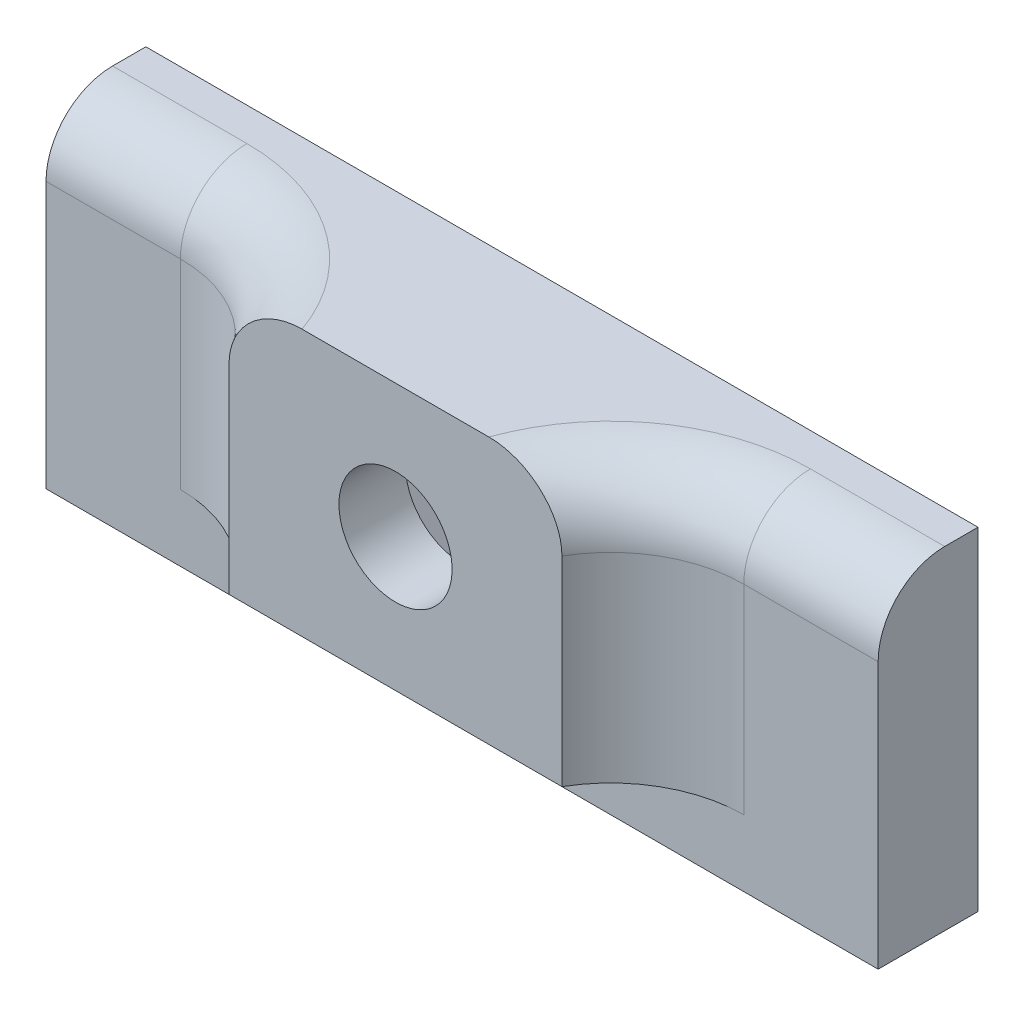
ISO-10303-21;
HEADER;
FILE_DESCRIPTION(('STEP AP214'),'2;1');
FILE_NAME('part.step','',(''),(''),'','','');
FILE_SCHEMA(('AUTOMOTIVE_DESIGN { 1 0 10303 214 1 1 1 1 }'));
ENDSEC;
DATA;
#1=APPLICATION_CONTEXT('core data for automotive mechanical design processes');
#2=APPLICATION_PROTOCOL_DEFINITION('international standard','automotive_design',2000,#1);
#3=PRODUCT_CONTEXT('',#1,'mechanical');
#4=PRODUCT('Part','Part','',(#3));
#5=PRODUCT_RELATED_PRODUCT_CATEGORY('part','',(#4));
#6=PRODUCT_DEFINITION_FORMATION('','',#4);
#7=PRODUCT_DEFINITION_CONTEXT('part definition',#1,'design');
#8=PRODUCT_DEFINITION('design','',#6,#7);
#9=PRODUCT_DEFINITION_SHAPE('','',#8);
#10=(LENGTH_UNIT() NAMED_UNIT(*) SI_UNIT(.MILLI.,.METRE.));
#11=(NAMED_UNIT(*) PLANE_ANGLE_UNIT() SI_UNIT($,.RADIAN.));
#12=(NAMED_UNIT(*) SI_UNIT($,.STERADIAN.) SOLID_ANGLE_UNIT());
#13=UNCERTAINTY_MEASURE_WITH_UNIT(LENGTH_MEASURE(1.E-05),#10,'distance_accuracy_value','');
#14=(GEOMETRIC_REPRESENTATION_CONTEXT(3) GLOBAL_UNCERTAINTY_ASSIGNED_CONTEXT((#13)) GLOBAL_UNIT_ASSIGNED_CONTEXT((#10,
#11,#12)) REPRESENTATION_CONTEXT('',''));
#15=CARTESIAN_POINT('',(0.,0.,0.));
#16=DIRECTION('',(0.,0.,1.));
#17=DIRECTION('',(1.,0.,0.));
#18=AXIS2_PLACEMENT_3D('',#15,#16,#17);
#19=CARTESIAN_POINT('',(0.,6.,5.));
#20=DIRECTION('',(0.,0.,-1.));
#21=DIRECTION('',(-1.,0.,0.));
#22=AXIS2_PLACEMENT_3D('',#19,#20,#21);
#23=CYLINDRICAL_SURFACE('',#22,1.7);
#24=CARTESIAN_POINT('',(0.,6.,5.));
#25=DIRECTION('',(0.,0.,-1.));
#26=DIRECTION('',(-1.,0.,0.));
#27=AXIS2_PLACEMENT_3D('',#24,#25,#26);
#28=CIRCLE('',#27,1.7);
#29=CARTESIAN_POINT('',(-1.7,6.,5.));
#30=VERTEX_POINT('',#29);
#31=EDGE_CURVE('E219',#30,#30,#28,.T.);
#32=ORIENTED_EDGE('',*,*,#31,.F.);
#33=EDGE_LOOP('',(#32));
#34=FACE_BOUND('',#33,.T.);
#35=CARTESIAN_POINT('',(0.,6.,3.));
#36=DIRECTION('',(0.,0.,-1.));
#37=DIRECTION('',(-1.,0.,0.));
#38=AXIS2_PLACEMENT_3D('',#35,#36,#37);
#39=CIRCLE('',#38,1.7);
#40=CARTESIAN_POINT('',(-1.7,6.,3.));
#41=VERTEX_POINT('',#40);
#42=EDGE_CURVE('E211',#41,#41,#39,.F.);
#43=ORIENTED_EDGE('',*,*,#42,.F.);
#44=EDGE_LOOP('',(#43));
#45=FACE_BOUND('',#44,.T.);
#46=ADVANCED_FACE('F35',(#34,#45),#23,.F.);
#47=CARTESIAN_POINT('',(12.5,0.,3.));
#48=DIRECTION('',(-1.,0.,0.));
#49=DIRECTION('',(0.,0.,1.));
#50=AXIS2_PLACEMENT_3D('',#47,#48,#49);
#51=PLANE('',#50);
#52=DIRECTION('',(0.,0.,-1.));
#53=VECTOR('',#52,1.);
#54=CARTESIAN_POINT('',(12.5,10.,3.));
#55=LINE('',#54,#53);
#56=CARTESIAN_POINT('',(12.5,10.,1.));
#57=VERTEX_POINT('',#56);
#58=CARTESIAN_POINT('',(12.5,10.,0.));
#59=VERTEX_POINT('',#58);
#60=EDGE_CURVE('E260',#57,#59,#55,.T.);
#61=ORIENTED_EDGE('',*,*,#60,.F.);
#62=CARTESIAN_POINT('',(12.5,8.,1.));
#63=DIRECTION('',(-1.,0.,0.));
#64=DIRECTION('',(0.,0.,1.));
#65=AXIS2_PLACEMENT_3D('',#62,#63,#64);
#66=CIRCLE('',#65,2.);
#67=CARTESIAN_POINT('',(12.5,8.,3.));
#68=VERTEX_POINT('',#67);
#69=EDGE_CURVE('E45',#57,#68,#66,.F.);
#70=ORIENTED_EDGE('',*,*,#69,.T.);
#71=DIRECTION('',(0.,1.,0.));
#72=VECTOR('',#71,1.);
#73=CARTESIAN_POINT('',(12.5,0.,3.));
#74=LINE('',#73,#72);
#75=CARTESIAN_POINT('',(12.5,0.,3.));
#76=VERTEX_POINT('',#75);
#77=EDGE_CURVE('E237',#76,#68,#74,.T.);
#78=ORIENTED_EDGE('',*,*,#77,.F.);
#79=DIRECTION('',(0.,0.,-1.));
#80=VECTOR('',#79,1.);
#81=CARTESIAN_POINT('',(12.5,0.,3.));
#82=LINE('',#81,#80);
#83=CARTESIAN_POINT('',(12.5,0.,0.));
#84=VERTEX_POINT('',#83);
#85=EDGE_CURVE('E244',#76,#84,#82,.T.);
#86=ORIENTED_EDGE('',*,*,#85,.T.);
#87=DIRECTION('',(0.,1.,0.));
#88=VECTOR('',#87,1.);
#89=CARTESIAN_POINT('',(12.5,0.,0.));
#90=LINE('',#89,#88);
#91=EDGE_CURVE('E234',#84,#59,#90,.T.);
#92=ORIENTED_EDGE('',*,*,#91,.T.);
#93=EDGE_LOOP('',(#61,#70,#78,#86,#92));
#94=FACE_BOUND('',#93,.T.);
#95=ADVANCED_FACE('F331',(#94),#51,.F.);
#96=CARTESIAN_POINT('',(12.5,10.,3.));
#97=DIRECTION('',(0.,-1.,0.));
#98=DIRECTION('',(0.,0.,-1.));
#99=AXIS2_PLACEMENT_3D('',#96,#97,#98);
#100=PLANE('',#99);
#101=DIRECTION('',(-1.,0.,0.));
#102=VECTOR('',#101,1.);
#103=CARTESIAN_POINT('',(-5.,10.,5.));
#104=LINE('',#103,#102);
#105=CARTESIAN_POINT('',(2.80724736564537,10.,5.));
#106=VERTEX_POINT('',#105);
#107=CARTESIAN_POINT('',(-2.80724736564538,10.,5.));
#108=VERTEX_POINT('',#107);
#109=EDGE_CURVE('E231',#106,#108,#104,.T.);
#110=ORIENTED_EDGE('',*,*,#109,.F.);
#111=CARTESIAN_POINT('',(8.46410161513776,10.,7.));
#112=DIRECTION('',(0.,-1.,0.));
#113=DIRECTION('',(0.,0.,-1.));
#114=AXIS2_PLACEMENT_3D('',#111,#112,#113);
#115=CIRCLE('',#114,6.);
#116=CARTESIAN_POINT('',(8.46410161513776,10.,1.));
#117=VERTEX_POINT('',#116);
#118=EDGE_CURVE('E280',#106,#117,#115,.T.);
#119=ORIENTED_EDGE('',*,*,#118,.T.);
#120=DIRECTION('',(-1.,0.,0.));
#121=VECTOR('',#120,1.);
#122=CARTESIAN_POINT('',(12.5,10.,1.));
#123=LINE('',#122,#121);
#124=EDGE_CURVE('E278',#117,#57,#123,.F.);
#125=ORIENTED_EDGE('',*,*,#124,.T.);
#126=ORIENTED_EDGE('',*,*,#60,.T.);
#127=DIRECTION('',(-1.,0.,0.));
#128=VECTOR('',#127,1.);
#129=CARTESIAN_POINT('',(12.5,10.,0.));
#130=LINE('',#129,#128);
#131=CARTESIAN_POINT('',(-12.5,10.,0.));
#132=VERTEX_POINT('',#131);
#133=EDGE_CURVE('E247',#59,#132,#130,.T.);
#134=ORIENTED_EDGE('',*,*,#133,.T.);
#135=DIRECTION('',(0.,0.,-1.));
#136=VECTOR('',#135,1.);
#137=CARTESIAN_POINT('',(-12.5,10.,3.));
#138=LINE('',#137,#136);
#139=CARTESIAN_POINT('',(-12.5,10.,1.));
#140=VERTEX_POINT('',#139);
#141=EDGE_CURVE('E258',#140,#132,#138,.T.);
#142=ORIENTED_EDGE('',*,*,#141,.F.);
#143=DIRECTION('',(-1.,0.,0.));
#144=VECTOR('',#143,1.);
#145=CARTESIAN_POINT('',(-8.46410161513776,10.,1.));
#146=LINE('',#145,#144);
#147=CARTESIAN_POINT('',(-8.46410161513776,10.,1.));
#148=VERTEX_POINT('',#147);
#149=EDGE_CURVE('E276',#140,#148,#146,.F.);
#150=ORIENTED_EDGE('',*,*,#149,.T.);
#151=CARTESIAN_POINT('',(-8.46410161513776,10.,7.));
#152=DIRECTION('',(0.,-1.,0.));
#153=DIRECTION('',(0.,0.,-1.));
#154=AXIS2_PLACEMENT_3D('',#151,#152,#153);
#155=CIRCLE('',#154,6.);
#156=EDGE_CURVE('E272',#148,#108,#155,.T.);
#157=ORIENTED_EDGE('',*,*,#156,.T.);
#158=EDGE_LOOP('',(#110,#119,#125,#126,#134,#142,#150,#157));
#159=FACE_BOUND('',#158,.T.);
#160=ADVANCED_FACE('F327',(#159),#100,.F.);
#161=CARTESIAN_POINT('',(-12.5,0.,3.));
#162=DIRECTION('',(1.,0.,0.));
#163=DIRECTION('',(0.,0.,-1.));
#164=AXIS2_PLACEMENT_3D('',#161,#162,#163);
#165=PLANE('',#164);
#166=DIRECTION('',(0.,-1.,0.));
#167=VECTOR('',#166,1.);
#168=CARTESIAN_POINT('',(-12.5,0.,3.));
#169=LINE('',#168,#167);
#170=CARTESIAN_POINT('',(-12.5,8.,3.));
#171=VERTEX_POINT('',#170);
#172=CARTESIAN_POINT('',(-12.5,0.,3.));
#173=VERTEX_POINT('',#172);
#174=EDGE_CURVE('E239',#171,#173,#169,.T.);
#175=ORIENTED_EDGE('',*,*,#174,.F.);
#176=CARTESIAN_POINT('',(-12.5,8.,1.));
#177=DIRECTION('',(1.,0.,0.));
#178=DIRECTION('',(0.,0.,-1.));
#179=AXIS2_PLACEMENT_3D('',#176,#177,#178);
#180=CIRCLE('',#179,2.);
#181=EDGE_CURVE('E60',#171,#140,#180,.F.);
#182=ORIENTED_EDGE('',*,*,#181,.T.);
#183=ORIENTED_EDGE('',*,*,#141,.T.);
#184=DIRECTION('',(0.,-1.,0.));
#185=VECTOR('',#184,1.);
#186=CARTESIAN_POINT('',(-12.5,0.,0.));
#187=LINE('',#186,#185);
#188=CARTESIAN_POINT('',(-12.5,0.,0.));
#189=VERTEX_POINT('',#188);
#190=EDGE_CURVE('E250',#132,#189,#187,.T.);
#191=ORIENTED_EDGE('',*,*,#190,.T.);
#192=DIRECTION('',(0.,0.,-1.));
#193=VECTOR('',#192,1.);
#194=CARTESIAN_POINT('',(-12.5,0.,3.));
#195=LINE('',#194,#193);
#196=EDGE_CURVE('E255',#173,#189,#195,.T.);
#197=ORIENTED_EDGE('',*,*,#196,.F.);
#198=EDGE_LOOP('',(#175,#182,#183,#191,#197));
#199=FACE_BOUND('',#198,.T.);
#200=ADVANCED_FACE('F323',(#199),#165,.F.);
#201=CARTESIAN_POINT('',(12.5,0.,3.));
#202=DIRECTION('',(0.,1.,0.));
#203=DIRECTION('',(0.,0.,1.));
#204=AXIS2_PLACEMENT_3D('',#201,#202,#203);
#205=PLANE('',#204);
#206=DIRECTION('',(1.,0.,0.));
#207=VECTOR('',#206,1.);
#208=CARTESIAN_POINT('',(12.5,0.,0.));
#209=LINE('',#208,#207);
#210=EDGE_CURVE('E240',#189,#84,#209,.T.);
#211=ORIENTED_EDGE('',*,*,#210,.T.);
#212=ORIENTED_EDGE('',*,*,#85,.F.);
#213=DIRECTION('',(1.,0.,0.));
#214=VECTOR('',#213,1.);
#215=CARTESIAN_POINT('',(12.5,0.,3.));
#216=LINE('',#215,#214);
#217=EDGE_CURVE('E242',#173,#76,#216,.T.);
#218=ORIENTED_EDGE('',*,*,#217,.F.);
#219=ORIENTED_EDGE('',*,*,#196,.T.);
#220=EDGE_LOOP('',(#211,#212,#218,#219));
#221=FACE_BOUND('',#220,.T.);
#222=ADVANCED_FACE('F316',(#221),#205,.F.);
#223=CARTESIAN_POINT('',(0.,0.,3.));
#224=DIRECTION('',(0.,0.,1.));
#225=DIRECTION('',(1.,0.,0.));
#226=AXIS2_PLACEMENT_3D('',#223,#224,#225);
#227=PLANE('',#226);
#228=DIRECTION('',(0.,1.,0.));
#229=VECTOR('',#228,1.);
#230=CARTESIAN_POINT('',(-8.46410161513776,10.,3.));
#231=LINE('',#230,#229);
#232=CARTESIAN_POINT('',(-8.46410161513776,2.,3.));
#233=VERTEX_POINT('',#232);
#234=CARTESIAN_POINT('',(-8.46410161513776,8.,3.));
#235=VERTEX_POINT('',#234);
#236=EDGE_CURVE('E262',#233,#235,#231,.T.);
#237=ORIENTED_EDGE('',*,*,#236,.T.);
#238=DIRECTION('',(-1.,0.,0.));
#239=VECTOR('',#238,1.);
#240=CARTESIAN_POINT('',(-12.5,8.,3.));
#241=LINE('',#240,#239);
#242=EDGE_CURVE('E542',#235,#171,#241,.T.);
#243=ORIENTED_EDGE('',*,*,#242,.T.);
#244=ORIENTED_EDGE('',*,*,#174,.T.);
#245=ORIENTED_EDGE('',*,*,#217,.T.);
#246=ORIENTED_EDGE('',*,*,#77,.T.);
#247=DIRECTION('',(-1.,0.,0.));
#248=VECTOR('',#247,1.);
#249=CARTESIAN_POINT('',(8.46410161513776,8.,3.));
#250=LINE('',#249,#248);
#251=CARTESIAN_POINT('',(8.46410161513776,8.,3.));
#252=VERTEX_POINT('',#251);
#253=EDGE_CURVE('E540',#68,#252,#250,.T.);
#254=ORIENTED_EDGE('',*,*,#253,.T.);
#255=DIRECTION('',(0.,-1.,0.));
#256=VECTOR('',#255,1.);
#257=CARTESIAN_POINT('',(8.46410161513776,2.,3.));
#258=LINE('',#257,#256);
#259=CARTESIAN_POINT('',(8.46410161513776,2.,3.));
#260=VERTEX_POINT('',#259);
#261=EDGE_CURVE('E265',#252,#260,#258,.T.);
#262=ORIENTED_EDGE('',*,*,#261,.T.);
#263=DIRECTION('',(1.,0.,0.));
#264=VECTOR('',#263,1.);
#265=CARTESIAN_POINT('',(-5.,2.,3.));
#266=LINE('',#265,#264);
#267=EDGE_CURVE('E222',#233,#260,#266,.T.);
#268=ORIENTED_EDGE('',*,*,#267,.F.);
#269=EDGE_LOOP('',(#237,#243,#244,#245,#246,#254,#262,#268));
#270=FACE_BOUND('',#269,.T.);
#271=ADVANCED_FACE('F313',(#270),#227,.T.);
#272=CARTESIAN_POINT('',(0.,0.,0.));
#273=DIRECTION('',(0.,0.,1.));
#274=DIRECTION('',(1.,0.,0.));
#275=AXIS2_PLACEMENT_3D('',#272,#273,#274);
#276=PLANE('',#275);
#277=DIRECTION('',(0.5,0.866025403784439,0.));
#278=VECTOR('',#277,1.);
#279=CARTESIAN_POINT('',(-3.46410161513775,6.,0.));
#280=LINE('',#279,#278);
#281=CARTESIAN_POINT('',(-3.46410161513776,6.,0.));
#282=VERTEX_POINT('',#281);
#283=CARTESIAN_POINT('',(-1.73205080756888,9.,0.));
#284=VERTEX_POINT('',#283);
#285=EDGE_CURVE('E198',#282,#284,#280,.T.);
#286=ORIENTED_EDGE('',*,*,#285,.F.);
#287=DIRECTION('',(-0.5,0.866025403784439,0.));
#288=VECTOR('',#287,1.);
#289=CARTESIAN_POINT('',(-1.73205080756888,3.,0.));
#290=LINE('',#289,#288);
#291=CARTESIAN_POINT('',(-1.73205080756888,3.,0.));
#292=VERTEX_POINT('',#291);
#293=EDGE_CURVE('E165',#292,#282,#290,.T.);
#294=ORIENTED_EDGE('',*,*,#293,.F.);
#295=DIRECTION('',(-1.,0.,0.));
#296=VECTOR('',#295,1.);
#297=CARTESIAN_POINT('',(1.73205080756888,3.,0.));
#298=LINE('',#297,#296);
#299=CARTESIAN_POINT('',(1.73205080756888,3.,0.));
#300=VERTEX_POINT('',#299);
#301=EDGE_CURVE('E184',#300,#292,#298,.T.);
#302=ORIENTED_EDGE('',*,*,#301,.F.);
#303=DIRECTION('',(-0.5,-0.866025403784439,0.));
#304=VECTOR('',#303,1.);
#305=CARTESIAN_POINT('',(3.46410161513775,5.99999999999999,0.));
#306=LINE('',#305,#304);
#307=CARTESIAN_POINT('',(3.46410161513775,5.99999999999999,0.));
#308=VERTEX_POINT('',#307);
#309=EDGE_CURVE('E187',#308,#300,#306,.T.);
#310=ORIENTED_EDGE('',*,*,#309,.F.);
#311=DIRECTION('',(0.5,-0.866025403784439,0.));
#312=VECTOR('',#311,1.);
#313=CARTESIAN_POINT('',(1.73205080756888,9.,0.));
#314=LINE('',#313,#312);
#315=CARTESIAN_POINT('',(1.73205080756888,9.,0.));
#316=VERTEX_POINT('',#315);
#317=EDGE_CURVE('E204',#316,#308,#314,.T.);
#318=ORIENTED_EDGE('',*,*,#317,.F.);
#319=DIRECTION('',(1.,0.,0.));
#320=VECTOR('',#319,1.);
#321=CARTESIAN_POINT('',(-1.73205080756888,9.,0.));
#322=LINE('',#321,#320);
#323=EDGE_CURVE('E201',#284,#316,#322,.T.);
#324=ORIENTED_EDGE('',*,*,#323,.F.);
#325=EDGE_LOOP('',(#286,#294,#302,#310,#318,#324));
#326=FACE_BOUND('',#325,.T.);
#327=ORIENTED_EDGE('',*,*,#91,.F.);
#328=ORIENTED_EDGE('',*,*,#210,.F.);
#329=ORIENTED_EDGE('',*,*,#190,.F.);
#330=ORIENTED_EDGE('',*,*,#133,.F.);
#331=EDGE_LOOP('',(#327,#328,#329,#330));
#332=FACE_BOUND('',#331,.T.);
#333=ADVANCED_FACE('F311',(#326,#332),#276,.F.);
#334=CARTESIAN_POINT('',(-5.,2.,5.));
#335=DIRECTION('',(0.,1.,0.));
#336=DIRECTION('',(-1.,0.,0.));
#337=AXIS2_PLACEMENT_3D('',#334,#335,#336);
#338=PLANE('',#337);
#339=ORIENTED_EDGE('',*,*,#267,.T.);
#340=CARTESIAN_POINT('',(8.46410161513776,2.,7.));
#341=DIRECTION('',(0.,1.,0.));
#342=DIRECTION('',(-1.,0.,0.));
#343=AXIS2_PLACEMENT_3D('',#340,#341,#342);
#344=CIRCLE('',#343,4.);
#345=CARTESIAN_POINT('',(5.,2.,5.));
#346=VERTEX_POINT('',#345);
#347=EDGE_CURVE('E267',#260,#346,#344,.T.);
#348=ORIENTED_EDGE('',*,*,#347,.T.);
#349=DIRECTION('',(1.,0.,0.));
#350=VECTOR('',#349,1.);
#351=CARTESIAN_POINT('',(-5.,2.,5.));
#352=LINE('',#351,#350);
#353=CARTESIAN_POINT('',(-5.,2.,5.));
#354=VERTEX_POINT('',#353);
#355=EDGE_CURVE('E225',#354,#346,#352,.T.);
#356=ORIENTED_EDGE('',*,*,#355,.F.);
#357=CARTESIAN_POINT('',(-8.46410161513776,2.,7.));
#358=DIRECTION('',(0.,1.,0.));
#359=DIRECTION('',(-1.,0.,0.));
#360=AXIS2_PLACEMENT_3D('',#357,#358,#359);
#361=CIRCLE('',#360,4.);
#362=EDGE_CURVE('E269',#354,#233,#361,.T.);
#363=ORIENTED_EDGE('',*,*,#362,.T.);
#364=EDGE_LOOP('',(#339,#348,#356,#363));
#365=FACE_BOUND('',#364,.T.);
#366=ADVANCED_FACE('F305',(#365),#338,.F.);
#367=CARTESIAN_POINT('',(0.,0.,5.));
#368=DIRECTION('',(0.,0.,1.));
#369=DIRECTION('',(1.,0.,0.));
#370=AXIS2_PLACEMENT_3D('',#367,#368,#369);
#371=PLANE('',#370);
#372=ORIENTED_EDGE('',*,*,#31,.T.);
#373=EDGE_LOOP('',(#372));
#374=FACE_BOUND('',#373,.T.);
#375=DIRECTION('',(0.,1.,0.));
#376=VECTOR('',#375,1.);
#377=CARTESIAN_POINT('',(5.,10.,5.));
#378=LINE('',#377,#376);
#379=CARTESIAN_POINT('',(5.,8.,5.));
#380=VERTEX_POINT('',#379);
#381=EDGE_CURVE('E228',#346,#380,#378,.T.);
#382=ORIENTED_EDGE('',*,*,#381,.T.);
#383=CARTESIAN_POINT('',(5.,8.,5.));
#384=CARTESIAN_POINT('',(5.00001279147313,8.05162755203347,5.));
#385=CARTESIAN_POINT('',(4.9976920523687,8.10324844719592,5.));
#386=CARTESIAN_POINT('',(4.98848188385639,8.20605755993822,5.));
#387=CARTESIAN_POINT('',(4.98159459498342,8.25724596886301,5.));
#388=CARTESIAN_POINT('',(4.96339535597768,8.35856472112983,5.));
#389=CARTESIAN_POINT('',(4.95210580711859,8.40869908791871,5.));
#390=CARTESIAN_POINT('',(4.92528565382639,8.507809188373,5.));
#391=CARTESIAN_POINT('',(4.90975471884902,8.55678483141211,5.));
#392=CARTESIAN_POINT('',(4.85716541358212,8.70133011514561,5.));
#393=CARTESIAN_POINT('',(4.81406447578661,8.79476707419258,5.));
#394=CARTESIAN_POINT('',(4.71379022453519,8.97376688407917,5.));
#395=CARTESIAN_POINT('',(4.65659998918848,9.05932009513808,5.));
#396=CARTESIAN_POINT('',(4.52591990835224,9.22662384805546,5.));
#397=CARTESIAN_POINT('',(4.45158075819122,9.30771039011313,5.));
#398=CARTESIAN_POINT('',(4.29165096276812,9.45786842118831,5.));
#399=CARTESIAN_POINT('',(4.206056698242,9.52693602865337,5.));
#400=CARTESIAN_POINT('',(4.01519578388859,9.6593587075771,5.));
#401=CARTESIAN_POINT('',(3.9087993570386,9.72108936794467,5.));
#402=CARTESIAN_POINT('',(3.68758561167398,9.82693628661047,5.));
#403=CARTESIAN_POINT('',(3.57276795237463,9.87105183160612,5.));
#404=CARTESIAN_POINT('',(3.35015892388697,9.93684580760174,5.));
#405=CARTESIAN_POINT('',(3.24292300982356,9.96041451642417,5.));
#406=CARTESIAN_POINT('',(3.02622748282421,9.99200533024006,5.));
#407=CARTESIAN_POINT('',(2.91676860560248,10.0000324968029,5.));
#408=CARTESIAN_POINT('',(2.80724736564537,10.,5.));
#409=B_SPLINE_CURVE_WITH_KNOTS('',3,(#383,#384,#385,#386,#387,#388,#389,#390,#391,#392,#393,
#394,#395,#396,#397,#398,#399,#400,#401,#402,#403,#404,#405,#406,#407,#408),.UNSPECIFIED.,.F.,
.F.,(4,2,2,2,2,2,2,2,2,2,2,2,4),(0.,0.154819511896355,0.309566504599122,0.463536119471956,
0.617517737095975,0.924731035586463,1.23231512568126,1.56100990712249,1.8898106453544,
2.25723982786195,2.62468388745665,2.95296429980192,3.28113777978854),.UNSPECIFIED.);
#410=EDGE_CURVE('E292',#380,#106,#409,.T.);
#411=ORIENTED_EDGE('',*,*,#410,.T.);
#412=ORIENTED_EDGE('',*,*,#109,.T.);
#413=CARTESIAN_POINT('',(-2.80724736564538,10.,5.));
#414=CARTESIAN_POINT('',(-2.87186690344334,9.99999857092787,5.));
#415=CARTESIAN_POINT('',(-2.93645105628427,9.99721493241806,5.));
#416=CARTESIAN_POINT('',(-3.06513784149349,9.98616665962554,5.));
#417=CARTESIAN_POINT('',(-3.12924055821764,9.97790300931714,5.));
#418=CARTESIAN_POINT('',(-3.32005201055369,9.94504893009086,5.));
#419=CARTESIAN_POINT('',(-3.44546284608498,9.9123948397282,5.));
#420=CARTESIAN_POINT('',(-3.68902516172317,9.82671951638629,5.));
#421=CARTESIAN_POINT('',(-3.80717766674505,9.7737011666524,5.));
#422=CARTESIAN_POINT('',(-4.03302167766039,9.64863308168055,5.));
#423=CARTESIAN_POINT('',(-4.14071054902605,9.57657857042422,5.));
#424=CARTESIAN_POINT('',(-4.34229081314744,9.41487898626144,5.));
#425=CARTESIAN_POINT('',(-4.4361612682903,9.32520769074869,5.));
#426=CARTESIAN_POINT('',(-4.6061289934802,9.13027886951767,5.));
#427=CARTESIAN_POINT('',(-4.68222890675283,9.02502366559136,5.));
#428=CARTESIAN_POINT('',(-4.80767313546125,8.80975177848362,5.));
#429=CARTESIAN_POINT('',(-4.85857582352454,8.7006575162489,5.));
#430=CARTESIAN_POINT('',(-4.91825469715881,8.5314176748239,5.));
#431=CARTESIAN_POINT('',(-4.93536235320348,8.47411306940245,5.));
#432=CARTESIAN_POINT('',(-4.96375060999658,8.35809079071699,5.));
#433=CARTESIAN_POINT('',(-4.97503528975927,8.29937413685641,5.));
#434=CARTESIAN_POINT('',(-4.98884347110535,8.20043924204934,5.));
#435=CARTESIAN_POINT('',(-4.9930247751064,8.16044416686902,5.));
#436=CARTESIAN_POINT('',(-4.99860327265777,8.08030204545488,5.));
#437=CARTESIAN_POINT('',(-5.00000333610298,8.04015519874775,5.));
#438=CARTESIAN_POINT('',(-5.,8.,5.));
#439=B_SPLINE_CURVE_WITH_KNOTS('',3,(#413,#414,#415,#416,#417,#418,#419,#420,#421,#422,#423,
#424,#425,#426,#427,#428,#429,#430,#431,#432,#433,#434,#435,#436,#437,#438),.UNSPECIFIED.,.F.,
.F.,(4,2,2,2,2,2,2,2,2,2,2,2,4),(0.,0.193731154646457,0.387427532929014,0.774231547712653,
1.16098081756263,1.54782721196444,1.93525385116453,2.32262282700041,2.68144679246565,
2.86061001227554,3.0396475566911,3.16019714831763,3.2806222829867),.UNSPECIFIED.);
#440=CARTESIAN_POINT('',(-5.,8.,5.));
#441=VERTEX_POINT('',#440);
#442=EDGE_CURVE('E285',#108,#441,#439,.T.);
#443=ORIENTED_EDGE('',*,*,#442,.T.);
#444=DIRECTION('',(0.,-1.,0.));
#445=VECTOR('',#444,1.);
#446=CARTESIAN_POINT('',(-5.,10.,5.));
#447=LINE('',#446,#445);
#448=EDGE_CURVE('E223',#441,#354,#447,.T.);
#449=ORIENTED_EDGE('',*,*,#448,.T.);
#450=ORIENTED_EDGE('',*,*,#355,.T.);
#451=EDGE_LOOP('',(#382,#411,#412,#443,#449,#450));
#452=FACE_BOUND('',#451,.T.);
#453=ADVANCED_FACE('F299',(#374,#452),#371,.T.);
#454=CARTESIAN_POINT('',(8.46410161513776,10.,7.));
#455=DIRECTION('',(0.,1.,0.));
#456=DIRECTION('',(-1.,0.,0.));
#457=AXIS2_PLACEMENT_3D('',#454,#455,#456);
#458=CYLINDRICAL_SURFACE('',#457,4.);
#459=ORIENTED_EDGE('',*,*,#261,.F.);
#460=CARTESIAN_POINT('',(8.46410161513776,8.,7.));
#461=DIRECTION('',(0.,-1.,0.));
#462=DIRECTION('',(0.,0.,-1.));
#463=AXIS2_PLACEMENT_3D('',#460,#461,#462);
#464=CIRCLE('',#463,4.);
#465=EDGE_CURVE('E283',#252,#380,#464,.F.);
#466=ORIENTED_EDGE('',*,*,#465,.T.);
#467=ORIENTED_EDGE('',*,*,#381,.F.);
#468=ORIENTED_EDGE('',*,*,#347,.F.);
#469=EDGE_LOOP('',(#459,#466,#467,#468));
#470=FACE_BOUND('',#469,.T.);
#471=ADVANCED_FACE('F304',(#470),#458,.F.);
#472=CARTESIAN_POINT('',(-8.46410161513776,10.,7.));
#473=DIRECTION('',(0.,-1.,0.));
#474=DIRECTION('',(1.,0.,0.));
#475=AXIS2_PLACEMENT_3D('',#472,#473,#474);
#476=CYLINDRICAL_SURFACE('',#475,4.);
#477=ORIENTED_EDGE('',*,*,#448,.F.);
#478=CARTESIAN_POINT('',(-8.46410161513776,8.,7.));
#479=DIRECTION('',(0.,-1.,0.));
#480=DIRECTION('',(0.,0.,-1.));
#481=AXIS2_PLACEMENT_3D('',#478,#479,#480);
#482=CIRCLE('',#481,4.);
#483=EDGE_CURVE('E11',#441,#235,#482,.F.);
#484=ORIENTED_EDGE('',*,*,#483,.T.);
#485=ORIENTED_EDGE('',*,*,#236,.F.);
#486=ORIENTED_EDGE('',*,*,#362,.F.);
#487=EDGE_LOOP('',(#477,#484,#485,#486));
#488=FACE_BOUND('',#487,.T.);
#489=ADVANCED_FACE('F337',(#488),#476,.F.);
#490=CARTESIAN_POINT('',(0.,0.,3.));
#491=DIRECTION('',(0.,0.,-1.));
#492=DIRECTION('',(-1.,0.,0.));
#493=AXIS2_PLACEMENT_3D('',#490,#491,#492);
#494=PLANE('',#493);
#495=DIRECTION('',(-0.5,0.866025403784439,0.));
#496=VECTOR('',#495,1.);
#497=CARTESIAN_POINT('',(-1.73205080756888,3.,3.));
#498=LINE('',#497,#496);
#499=CARTESIAN_POINT('',(-1.73205080756888,3.,3.));
#500=VERTEX_POINT('',#499);
#501=CARTESIAN_POINT('',(-3.46410161513775,6.,3.));
#502=VERTEX_POINT('',#501);
#503=EDGE_CURVE('E162',#500,#502,#498,.T.);
#504=ORIENTED_EDGE('',*,*,#503,.T.);
#505=DIRECTION('',(0.5,0.866025403784439,0.));
#506=VECTOR('',#505,1.);
#507=CARTESIAN_POINT('',(-3.46410161513775,6.,3.));
#508=LINE('',#507,#506);
#509=CARTESIAN_POINT('',(-1.73205080756888,9.,3.));
#510=VERTEX_POINT('',#509);
#511=EDGE_CURVE('E173',#502,#510,#508,.T.);
#512=ORIENTED_EDGE('',*,*,#511,.T.);
#513=DIRECTION('',(1.,0.,0.));
#514=VECTOR('',#513,1.);
#515=CARTESIAN_POINT('',(-1.73205080756888,9.,3.));
#516=LINE('',#515,#514);
#517=CARTESIAN_POINT('',(1.73205080756888,9.,3.));
#518=VERTEX_POINT('',#517);
#519=EDGE_CURVE('E178',#510,#518,#516,.T.);
#520=ORIENTED_EDGE('',*,*,#519,.T.);
#521=DIRECTION('',(0.5,-0.866025403784439,0.));
#522=VECTOR('',#521,1.);
#523=CARTESIAN_POINT('',(1.73205080756888,9.,3.));
#524=LINE('',#523,#522);
#525=CARTESIAN_POINT('',(3.46410161513775,5.99999999999999,3.));
#526=VERTEX_POINT('',#525);
#527=EDGE_CURVE('E191',#518,#526,#524,.T.);
#528=ORIENTED_EDGE('',*,*,#527,.T.);
#529=DIRECTION('',(-0.5,-0.866025403784439,0.));
#530=VECTOR('',#529,1.);
#531=CARTESIAN_POINT('',(3.46410161513775,5.99999999999999,3.));
#532=LINE('',#531,#530);
#533=CARTESIAN_POINT('',(1.73205080756888,3.,3.));
#534=VERTEX_POINT('',#533);
#535=EDGE_CURVE('E194',#526,#534,#532,.T.);
#536=ORIENTED_EDGE('',*,*,#535,.T.);
#537=DIRECTION('',(-1.,0.,0.));
#538=VECTOR('',#537,1.);
#539=CARTESIAN_POINT('',(1.73205080756888,3.,3.));
#540=LINE('',#539,#538);
#541=EDGE_CURVE('E170',#534,#500,#540,.T.);
#542=ORIENTED_EDGE('',*,*,#541,.T.);
#543=EDGE_LOOP('',(#504,#512,#520,#528,#536,#542));
#544=FACE_BOUND('',#543,.T.);
#545=ORIENTED_EDGE('',*,*,#42,.T.);
#546=EDGE_LOOP('',(#545));
#547=FACE_BOUND('',#546,.T.);
#548=ADVANCED_FACE('F180',(#544,#547),#494,.T.);
#549=CARTESIAN_POINT('',(-1.73205080756888,3.,3.));
#550=DIRECTION('',(-0.866025403784439,-0.5,0.));
#551=DIRECTION('',(0.5,-0.866025403784439,0.));
#552=AXIS2_PLACEMENT_3D('',#549,#550,#551);
#553=PLANE('',#552);
#554=ORIENTED_EDGE('',*,*,#293,.T.);
#555=DIRECTION('',(0.,0.,-1.));
#556=VECTOR('',#555,1.);
#557=CARTESIAN_POINT('',(-3.46410161513775,6.,3.));
#558=LINE('',#557,#556);
#559=EDGE_CURVE('E158',#502,#282,#558,.T.);
#560=ORIENTED_EDGE('',*,*,#559,.F.);
#561=ORIENTED_EDGE('',*,*,#503,.F.);
#562=DIRECTION('',(0.,0.,-1.));
#563=VECTOR('',#562,1.);
#564=CARTESIAN_POINT('',(-1.73205080756888,3.,3.));
#565=LINE('',#564,#563);
#566=EDGE_CURVE('E209',#500,#292,#565,.T.);
#567=ORIENTED_EDGE('',*,*,#566,.T.);
#568=EDGE_LOOP('',(#554,#560,#561,#567));
#569=FACE_BOUND('',#568,.T.);
#570=ADVANCED_FACE('F160',(#569),#553,.F.);
#571=CARTESIAN_POINT('',(1.73205080756888,3.,3.));
#572=DIRECTION('',(0.,-1.,0.));
#573=DIRECTION('',(0.,0.,-1.));
#574=AXIS2_PLACEMENT_3D('',#571,#572,#573);
#575=PLANE('',#574);
#576=ORIENTED_EDGE('',*,*,#301,.T.);
#577=ORIENTED_EDGE('',*,*,#566,.F.);
#578=ORIENTED_EDGE('',*,*,#541,.F.);
#579=DIRECTION('',(0.,0.,-1.));
#580=VECTOR('',#579,1.);
#581=CARTESIAN_POINT('',(1.73205080756888,3.,3.));
#582=LINE('',#581,#580);
#583=EDGE_CURVE('E212',#534,#300,#582,.T.);
#584=ORIENTED_EDGE('',*,*,#583,.T.);
#585=EDGE_LOOP('',(#576,#577,#578,#584));
#586=FACE_BOUND('',#585,.T.);
#587=ADVANCED_FACE('F368',(#586),#575,.F.);
#588=CARTESIAN_POINT('',(3.46410161513775,5.99999999999999,3.));
#589=DIRECTION('',(0.866025403784439,-0.5,0.));
#590=DIRECTION('',(0.5,0.866025403784439,0.));
#591=AXIS2_PLACEMENT_3D('',#588,#589,#590);
#592=PLANE('',#591);
#593=ORIENTED_EDGE('',*,*,#309,.T.);
#594=ORIENTED_EDGE('',*,*,#583,.F.);
#595=ORIENTED_EDGE('',*,*,#535,.F.);
#596=DIRECTION('',(0.,0.,-1.));
#597=VECTOR('',#596,1.);
#598=CARTESIAN_POINT('',(3.46410161513775,5.99999999999999,3.));
#599=LINE('',#598,#597);
#600=EDGE_CURVE('E214',#526,#308,#599,.T.);
#601=ORIENTED_EDGE('',*,*,#600,.T.);
#602=EDGE_LOOP('',(#593,#594,#595,#601));
#603=FACE_BOUND('',#602,.T.);
#604=ADVANCED_FACE('F372',(#603),#592,.F.);
#605=CARTESIAN_POINT('',(1.73205080756888,9.,3.));
#606=DIRECTION('',(0.866025403784439,0.5,0.));
#607=DIRECTION('',(-0.5,0.866025403784439,0.));
#608=AXIS2_PLACEMENT_3D('',#605,#606,#607);
#609=PLANE('',#608);
#610=ORIENTED_EDGE('',*,*,#317,.T.);
#611=ORIENTED_EDGE('',*,*,#600,.F.);
#612=ORIENTED_EDGE('',*,*,#527,.F.);
#613=DIRECTION('',(0.,0.,-1.));
#614=VECTOR('',#613,1.);
#615=CARTESIAN_POINT('',(1.73205080756888,9.,3.));
#616=LINE('',#615,#614);
#617=EDGE_CURVE('E216',#518,#316,#616,.T.);
#618=ORIENTED_EDGE('',*,*,#617,.T.);
#619=EDGE_LOOP('',(#610,#611,#612,#618));
#620=FACE_BOUND('',#619,.T.);
#621=ADVANCED_FACE('F376',(#620),#609,.F.);
#622=CARTESIAN_POINT('',(-1.73205080756888,9.,3.));
#623=DIRECTION('',(0.,1.,0.));
#624=DIRECTION('',(0.,0.,1.));
#625=AXIS2_PLACEMENT_3D('',#622,#623,#624);
#626=PLANE('',#625);
#627=ORIENTED_EDGE('',*,*,#323,.T.);
#628=ORIENTED_EDGE('',*,*,#617,.F.);
#629=ORIENTED_EDGE('',*,*,#519,.F.);
#630=DIRECTION('',(0.,0.,-1.));
#631=VECTOR('',#630,1.);
#632=CARTESIAN_POINT('',(-1.73205080756888,9.,3.));
#633=LINE('',#632,#631);
#634=EDGE_CURVE('E169',#510,#284,#633,.T.);
#635=ORIENTED_EDGE('',*,*,#634,.T.);
#636=EDGE_LOOP('',(#627,#628,#629,#635));
#637=FACE_BOUND('',#636,.T.);
#638=ADVANCED_FACE('F380',(#637),#626,.F.);
#639=CARTESIAN_POINT('',(-3.46410161513775,6.,3.));
#640=DIRECTION('',(-0.866025403784439,0.5,0.));
#641=DIRECTION('',(-0.5,-0.866025403784439,0.));
#642=AXIS2_PLACEMENT_3D('',#639,#640,#641);
#643=PLANE('',#642);
#644=ORIENTED_EDGE('',*,*,#285,.T.);
#645=ORIENTED_EDGE('',*,*,#634,.F.);
#646=ORIENTED_EDGE('',*,*,#511,.F.);
#647=ORIENTED_EDGE('',*,*,#559,.T.);
#648=EDGE_LOOP('',(#644,#645,#646,#647));
#649=FACE_BOUND('',#648,.T.);
#650=ADVANCED_FACE('F174',(#649),#643,.F.);
#651=CARTESIAN_POINT('',(0.,8.,1.));
#652=DIRECTION('',(1.,0.,0.));
#653=DIRECTION('',(0.,0.,-1.));
#654=AXIS2_PLACEMENT_3D('',#651,#652,#653);
#655=CYLINDRICAL_SURFACE('',#654,2.);
#656=ORIENTED_EDGE('',*,*,#69,.F.);
#657=ORIENTED_EDGE('',*,*,#124,.F.);
#658=CARTESIAN_POINT('',(8.46410161513776,8.,1.));
#659=DIRECTION('',(-1.,0.,0.));
#660=DIRECTION('',(0.,0.,1.));
#661=AXIS2_PLACEMENT_3D('',#658,#659,#660);
#662=CIRCLE('',#661,2.);
#663=EDGE_CURVE('E199',#252,#117,#662,.T.);
#664=ORIENTED_EDGE('',*,*,#663,.F.);
#665=ORIENTED_EDGE('',*,*,#253,.F.);
#666=EDGE_LOOP('',(#656,#657,#664,#665));
#667=FACE_BOUND('',#666,.T.);
#668=ADVANCED_FACE('F345',(#667),#655,.T.);
#669=CARTESIAN_POINT('',(8.46410161513776,8.,7.));
#670=DIRECTION('',(0.,-1.,0.));
#671=DIRECTION('',(0.,0.,-1.));
#672=AXIS2_PLACEMENT_3D('',#669,#670,#671);
#673=TOROIDAL_SURFACE('',#672,6.,2.);
#674=ORIENTED_EDGE('',*,*,#410,.F.);
#675=ORIENTED_EDGE('',*,*,#465,.F.);
#676=ORIENTED_EDGE('',*,*,#663,.T.);
#677=ORIENTED_EDGE('',*,*,#118,.F.);
#678=EDGE_LOOP('',(#674,#675,#676,#677));
#679=FACE_BOUND('',#678,.T.);
#680=ADVANCED_FACE('F341',(#679),#673,.T.);
#681=CARTESIAN_POINT('',(-8.46410161513776,8.,7.));
#682=DIRECTION('',(0.,-1.,0.));
#683=DIRECTION('',(0.,0.,-1.));
#684=AXIS2_PLACEMENT_3D('',#681,#682,#683);
#685=TOROIDAL_SURFACE('',#684,6.,2.);
#686=ORIENTED_EDGE('',*,*,#442,.F.);
#687=ORIENTED_EDGE('',*,*,#156,.F.);
#688=CARTESIAN_POINT('',(-8.46410161513776,8.,1.));
#689=DIRECTION('',(-1.,0.,0.));
#690=DIRECTION('',(0.,0.,1.));
#691=AXIS2_PLACEMENT_3D('',#688,#689,#690);
#692=CIRCLE('',#691,2.);
#693=EDGE_CURVE('E40',#235,#148,#692,.T.);
#694=ORIENTED_EDGE('',*,*,#693,.F.);
#695=ORIENTED_EDGE('',*,*,#483,.F.);
#696=EDGE_LOOP('',(#686,#687,#694,#695));
#697=FACE_BOUND('',#696,.T.);
#698=ADVANCED_FACE('F37',(#697),#685,.T.);
#699=CARTESIAN_POINT('',(0.,8.,1.));
#700=DIRECTION('',(1.,0.,0.));
#701=DIRECTION('',(0.,0.,-1.));
#702=AXIS2_PLACEMENT_3D('',#699,#700,#701);
#703=CYLINDRICAL_SURFACE('',#702,2.);
#704=ORIENTED_EDGE('',*,*,#693,.T.);
#705=ORIENTED_EDGE('',*,*,#149,.F.);
#706=ORIENTED_EDGE('',*,*,#181,.F.);
#707=ORIENTED_EDGE('',*,*,#242,.F.);
#708=EDGE_LOOP('',(#704,#705,#706,#707));
#709=FACE_BOUND('',#708,.T.);
#710=ADVANCED_FACE('F349',(#709),#703,.T.);
#711=CLOSED_SHELL('',(#46,#95,#160,#200,#222,#271,#333,#366,#453,#471,#489,#548,#570,#587,#604,
#621,#638,#650,#668,#680,#698,#710));
#712=MANIFOLD_SOLID_BREP('B2',#711);
#713=ADVANCED_BREP_SHAPE_REPRESENTATION('',(#18,#712),#14);
#714=SHAPE_DEFINITION_REPRESENTATION(#9,#713);
ENDSEC;
END-ISO-10303-21;
